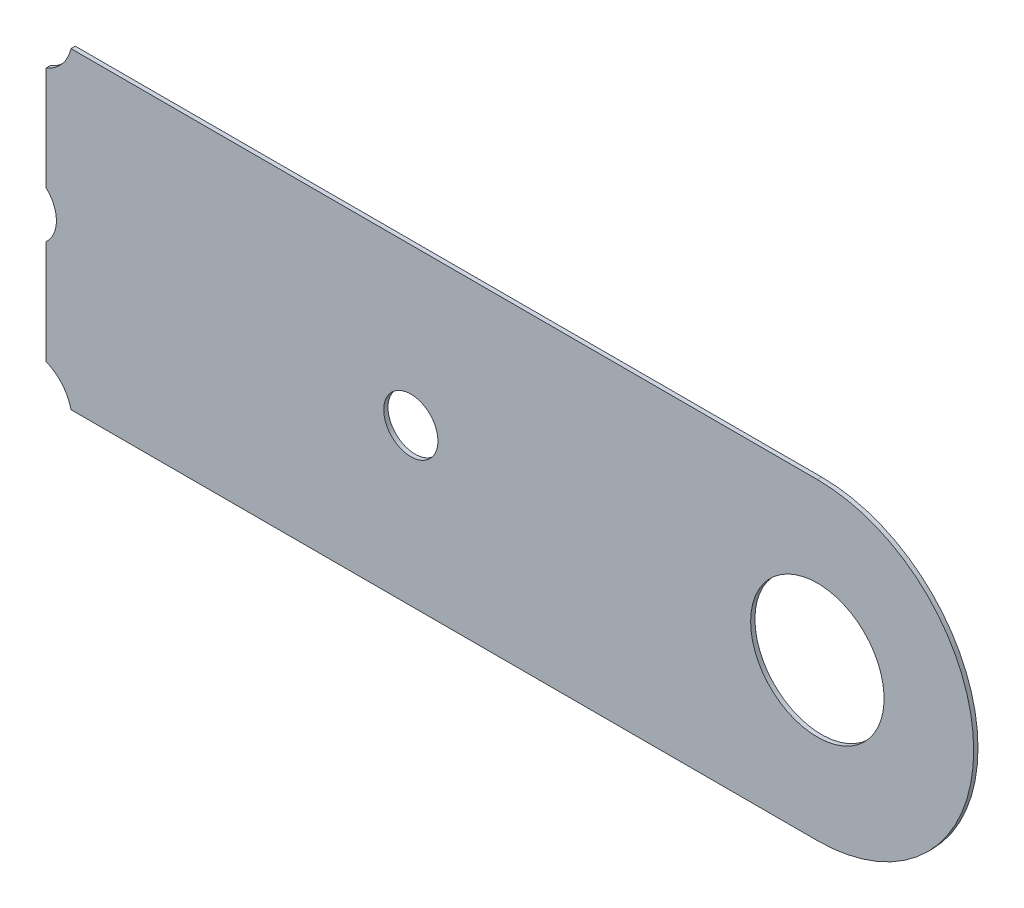
ISO-10303-21;
HEADER;
FILE_DESCRIPTION(('STEP AP214'),'2;1');
FILE_NAME('part.step','',(''),(''),'','','');
FILE_SCHEMA(('AUTOMOTIVE_DESIGN { 1 0 10303 214 1 1 1 1 }'));
ENDSEC;
DATA;
#1=APPLICATION_CONTEXT('core data for automotive mechanical design processes');
#2=APPLICATION_PROTOCOL_DEFINITION('international standard','automotive_design',2000,#1);
#3=PRODUCT_CONTEXT('',#1,'mechanical');
#4=PRODUCT('Part','Part','',(#3));
#5=PRODUCT_RELATED_PRODUCT_CATEGORY('part','',(#4));
#6=PRODUCT_DEFINITION_FORMATION('','',#4);
#7=PRODUCT_DEFINITION_CONTEXT('part definition',#1,'design');
#8=PRODUCT_DEFINITION('design','',#6,#7);
#9=PRODUCT_DEFINITION_SHAPE('','',#8);
#10=(LENGTH_UNIT() NAMED_UNIT(*) SI_UNIT(.MILLI.,.METRE.));
#11=(NAMED_UNIT(*) PLANE_ANGLE_UNIT() SI_UNIT($,.RADIAN.));
#12=(NAMED_UNIT(*) SI_UNIT($,.STERADIAN.) SOLID_ANGLE_UNIT());
#13=UNCERTAINTY_MEASURE_WITH_UNIT(LENGTH_MEASURE(1.E-05),#10,'distance_accuracy_value','');
#14=(GEOMETRIC_REPRESENTATION_CONTEXT(3) GLOBAL_UNCERTAINTY_ASSIGNED_CONTEXT((#13)) GLOBAL_UNIT_ASSIGNED_CONTEXT((#10,
#11,#12)) REPRESENTATION_CONTEXT('',''));
#15=CARTESIAN_POINT('',(0.,0.,0.));
#16=DIRECTION('',(0.,0.,1.));
#17=DIRECTION('',(1.,0.,0.));
#18=AXIS2_PLACEMENT_3D('',#15,#16,#17);
#19=CARTESIAN_POINT('',(0.,12.7639318,0.41148));
#20=DIRECTION('',(0.,0.,-1.));
#21=DIRECTION('',(-1.,0.,0.));
#22=AXIS2_PLACEMENT_3D('',#19,#20,#21);
#23=PLANE('',#22);
#24=CARTESIAN_POINT('',(73.99999932,15.00000048,0.41148));
#25=DIRECTION('',(0.,0.,-1.));
#26=DIRECTION('',(-1.,0.,0.));
#27=AXIS2_PLACEMENT_3D('',#24,#25,#26);
#28=CIRCLE('',#27,6.3999999);
#29=CARTESIAN_POINT('',(67.59999942,15.00000048,0.41148));
#30=VERTEX_POINT('',#29);
#31=EDGE_CURVE('E132',#30,#30,#28,.T.);
#32=ORIENTED_EDGE('',*,*,#31,.T.);
#33=EDGE_LOOP('',(#32));
#34=FACE_BOUND('',#33,.T.);
#35=CARTESIAN_POINT('',(35.00000112,15.00000048,0.41148));
#36=DIRECTION('',(0.,0.,-1.));
#37=DIRECTION('',(-1.,0.,0.));
#38=AXIS2_PLACEMENT_3D('',#35,#36,#37);
#39=CIRCLE('',#38,2.59999988);
#40=CARTESIAN_POINT('',(32.40000124,15.00000048,0.41148));
#41=VERTEX_POINT('',#40);
#42=EDGE_CURVE('E135',#41,#41,#39,.T.);
#43=ORIENTED_EDGE('',*,*,#42,.T.);
#44=EDGE_LOOP('',(#43));
#45=FACE_BOUND('',#44,.T.);
#46=CARTESIAN_POINT('',(-1.500005936344,-0.900000909921,0.41148));
#47=DIRECTION('',(0.,0.,-1.));
#48=DIRECTION('',(-1.,0.,0.));
#49=AXIS2_PLACEMENT_3D('',#46,#47,#48);
#50=CIRCLE('',#49,4.00000334447);
#51=CARTESIAN_POINT('',(0.,2.80809953999997,0.41148));
#52=VERTEX_POINT('',#51);
#53=CARTESIAN_POINT('',(2.39743234000016,0.,0.41148));
#54=VERTEX_POINT('',#53);
#55=EDGE_CURVE('E110',#52,#54,#50,.T.);
#56=ORIENTED_EDGE('',*,*,#55,.T.);
#57=DIRECTION('',(1.,0.,0.));
#58=VECTOR('',#57,1.);
#59=CARTESIAN_POINT('',(73.99999932,0.,0.41148));
#60=LINE('',#59,#58);
#61=CARTESIAN_POINT('',(73.99999932,0.,0.41148));
#62=VERTEX_POINT('',#61);
#63=EDGE_CURVE('E107',#62,#54,#60,.F.);
#64=ORIENTED_EDGE('',*,*,#63,.F.);
#65=CARTESIAN_POINT('',(73.99999932,15.00000048,0.41148));
#66=DIRECTION('',(0.,0.,-1.));
#67=DIRECTION('',(-1.,0.,0.));
#68=AXIS2_PLACEMENT_3D('',#65,#66,#67);
#69=CIRCLE('',#68,15.00000048);
#70=CARTESIAN_POINT('',(73.99999932,30.00000096,0.41148));
#71=VERTEX_POINT('',#70);
#72=EDGE_CURVE('E140',#71,#62,#69,.T.);
#73=ORIENTED_EDGE('',*,*,#72,.F.);
#74=DIRECTION('',(1.,0.,0.));
#75=VECTOR('',#74,1.);
#76=CARTESIAN_POINT('',(2.39743488,30.00000096,0.41148));
#77=LINE('',#76,#75);
#78=CARTESIAN_POINT('',(2.3974348800001,30.00000096,0.41148));
#79=VERTEX_POINT('',#78);
#80=EDGE_CURVE('E112',#79,#71,#77,.T.);
#81=ORIENTED_EDGE('',*,*,#80,.F.);
#82=CARTESIAN_POINT('',(-1.499997542216,30.899999585498,0.41148));
#83=DIRECTION('',(0.,0.,-1.));
#84=DIRECTION('',(-1.,0.,0.));
#85=AXIS2_PLACEMENT_3D('',#82,#83,#84);
#86=CIRCLE('',#85,3.999997126454);
#87=CARTESIAN_POINT('',(-2.54000005528171E-06,27.1919014200003,0.41148));
#88=VERTEX_POINT('',#87);
#89=EDGE_CURVE('E92',#79,#88,#86,.T.);
#90=ORIENTED_EDGE('',*,*,#89,.T.);
#91=DIRECTION('',(2.55126772493192E-07,-0.999999999999967,0.));
#92=VECTOR('',#91,1.);
#93=CARTESIAN_POINT('',(0.,17.23606662,0.41148));
#94=LINE('',#93,#92);
#95=CARTESIAN_POINT('',(0.,17.2360666199999,0.41148));
#96=VERTEX_POINT('',#95);
#97=EDGE_CURVE('E90',#96,#88,#94,.F.);
#98=ORIENTED_EDGE('',*,*,#97,.F.);
#99=CARTESIAN_POINT('',(-2.000004731039,14.99999921,0.41148));
#100=DIRECTION('',(0.,0.,-1.));
#101=DIRECTION('',(-1.,0.,0.));
#102=AXIS2_PLACEMENT_3D('',#99,#100,#101);
#103=CIRCLE('',#102,3.000002731039);
#104=CARTESIAN_POINT('',(0.,12.7639318000001,0.41148));
#105=VERTEX_POINT('',#104);
#106=EDGE_CURVE('E20',#96,#105,#103,.T.);
#107=ORIENTED_EDGE('',*,*,#106,.T.);
#108=DIRECTION('',(0.,1.,0.));
#109=VECTOR('',#108,1.);
#110=CARTESIAN_POINT('',(0.,2.80809954,0.41148));
#111=LINE('',#110,#109);
#112=EDGE_CURVE('E105',#52,#105,#111,.T.);
#113=ORIENTED_EDGE('',*,*,#112,.F.);
#114=EDGE_LOOP('',(#56,#64,#73,#81,#90,#98,#107,#113));
#115=FACE_BOUND('',#114,.T.);
#116=ADVANCED_FACE('F17',(#34,#45,#115),#23,.F.);
#117=CARTESIAN_POINT('',(-2.000004731039,14.99999921,0.));
#118=DIRECTION('',(0.,0.,-1.));
#119=DIRECTION('',(-1.,0.,0.));
#120=AXIS2_PLACEMENT_3D('',#117,#118,#119);
#121=CYLINDRICAL_SURFACE('',#120,3.000002731039);
#122=ORIENTED_EDGE('',*,*,#106,.F.);
#123=DIRECTION('',(0.,0.,1.));
#124=VECTOR('',#123,1.);
#125=CARTESIAN_POINT('',(0.,17.23606662,0.));
#126=LINE('',#125,#124);
#127=CARTESIAN_POINT('',(0.,17.2360666199999,0.));
#128=VERTEX_POINT('',#127);
#129=EDGE_CURVE('E82',#128,#96,#126,.T.);
#130=ORIENTED_EDGE('',*,*,#129,.F.);
#131=CARTESIAN_POINT('',(-2.000004731039,14.99999921,0.));
#132=DIRECTION('',(0.,0.,-1.));
#133=DIRECTION('',(-1.,0.,0.));
#134=AXIS2_PLACEMENT_3D('',#131,#132,#133);
#135=CIRCLE('',#134,3.000002731039);
#136=CARTESIAN_POINT('',(0.,12.7639318000001,0.));
#137=VERTEX_POINT('',#136);
#138=EDGE_CURVE('E130',#137,#128,#135,.F.);
#139=ORIENTED_EDGE('',*,*,#138,.F.);
#140=DIRECTION('',(0.,0.,1.));
#141=VECTOR('',#140,1.);
#142=CARTESIAN_POINT('',(0.,12.7639318,0.));
#143=LINE('',#142,#141);
#144=EDGE_CURVE('E85',#105,#137,#143,.F.);
#145=ORIENTED_EDGE('',*,*,#144,.F.);
#146=EDGE_LOOP('',(#122,#130,#139,#145));
#147=FACE_BOUND('',#146,.T.);
#148=ADVANCED_FACE('F80',(#147),#121,.F.);
#149=CARTESIAN_POINT('',(0.,17.23606662,0.));
#150=DIRECTION('',(-0.999999999999967,-2.55126772493192E-07,0.));
#151=DIRECTION('',(2.55126772493192E-07,-0.999999999999967,0.));
#152=AXIS2_PLACEMENT_3D('',#149,#150,#151);
#153=PLANE('',#152);
#154=DIRECTION('',(0.,0.,-1.));
#155=VECTOR('',#154,1.);
#156=CARTESIAN_POINT('',(-2.54000011063078E-06,27.1919014200003,0.));
#157=LINE('',#156,#155);
#158=CARTESIAN_POINT('',(-1.27000005542381E-06,27.1919019337395,0.));
#159=VERTEX_POINT('',#158);
#160=EDGE_CURVE('E103',#88,#159,#157,.T.);
#161=ORIENTED_EDGE('',*,*,#160,.T.);
#162=DIRECTION('',(0.,1.,0.));
#163=VECTOR('',#162,1.);
#164=CARTESIAN_POINT('',(0.,12.7639318,0.));
#165=LINE('',#164,#163);
#166=EDGE_CURVE('E98',#128,#159,#165,.T.);
#167=ORIENTED_EDGE('',*,*,#166,.F.);
#168=ORIENTED_EDGE('',*,*,#129,.T.);
#169=ORIENTED_EDGE('',*,*,#97,.T.);
#170=EDGE_LOOP('',(#161,#167,#168,#169));
#171=FACE_BOUND('',#170,.T.);
#172=ADVANCED_FACE('F96',(#171),#153,.T.);
#173=CARTESIAN_POINT('',(-1.499997542216,30.899999585498,0.));
#174=DIRECTION('',(0.,0.,-1.));
#175=DIRECTION('',(-1.,0.,0.));
#176=AXIS2_PLACEMENT_3D('',#173,#174,#175);
#177=CYLINDRICAL_SURFACE('',#176,3.999997126454);
#178=ORIENTED_EDGE('',*,*,#89,.F.);
#179=DIRECTION('',(0.,0.,1.));
#180=VECTOR('',#179,1.);
#181=CARTESIAN_POINT('',(2.39743488,30.00000096,0.));
#182=LINE('',#181,#180);
#183=CARTESIAN_POINT('',(2.3974348800001,30.00000096,0.));
#184=VERTEX_POINT('',#183);
#185=EDGE_CURVE('E114',#184,#79,#182,.T.);
#186=ORIENTED_EDGE('',*,*,#185,.F.);
#187=CARTESIAN_POINT('',(-1.499997542216,30.899999585498,0.));
#188=DIRECTION('',(0.,0.,-1.));
#189=DIRECTION('',(-1.,0.,0.));
#190=AXIS2_PLACEMENT_3D('',#187,#188,#189);
#191=CIRCLE('',#190,3.999997126454);
#192=EDGE_CURVE('E127',#159,#184,#191,.F.);
#193=ORIENTED_EDGE('',*,*,#192,.F.);
#194=ORIENTED_EDGE('',*,*,#160,.F.);
#195=EDGE_LOOP('',(#178,#186,#193,#194));
#196=FACE_BOUND('',#195,.T.);
#197=ADVANCED_FACE('F175',(#196),#177,.F.);
#198=CARTESIAN_POINT('',(2.39743488,30.00000096,0.));
#199=DIRECTION('',(0.,1.,0.));
#200=DIRECTION('',(0.,0.,1.));
#201=AXIS2_PLACEMENT_3D('',#198,#199,#200);
#202=PLANE('',#201);
#203=DIRECTION('',(0.,0.,-1.));
#204=VECTOR('',#203,1.);
#205=CARTESIAN_POINT('',(73.99999932,30.00000096,0.));
#206=LINE('',#205,#204);
#207=CARTESIAN_POINT('',(73.99999932,30.00000096,0.));
#208=VERTEX_POINT('',#207);
#209=EDGE_CURVE('E113',#208,#71,#206,.F.);
#210=ORIENTED_EDGE('',*,*,#209,.F.);
#211=DIRECTION('',(-1.,0.,0.));
#212=VECTOR('',#211,1.);
#213=CARTESIAN_POINT('',(0.,30.00000096,0.));
#214=LINE('',#213,#212);
#215=EDGE_CURVE('E126',#184,#208,#214,.F.);
#216=ORIENTED_EDGE('',*,*,#215,.F.);
#217=ORIENTED_EDGE('',*,*,#185,.T.);
#218=ORIENTED_EDGE('',*,*,#80,.T.);
#219=EDGE_LOOP('',(#210,#216,#217,#218));
#220=FACE_BOUND('',#219,.T.);
#221=ADVANCED_FACE('F173',(#220),#202,.T.);
#222=CARTESIAN_POINT('',(73.99999932,15.00000048,0.));
#223=DIRECTION('',(0.,0.,-1.));
#224=DIRECTION('',(-1.,0.,0.));
#225=AXIS2_PLACEMENT_3D('',#222,#223,#224);
#226=CYLINDRICAL_SURFACE('',#225,15.00000048);
#227=DIRECTION('',(0.,0.,-1.));
#228=VECTOR('',#227,1.);
#229=CARTESIAN_POINT('',(73.99999932,0.,0.));
#230=LINE('',#229,#228);
#231=CARTESIAN_POINT('',(73.99999932,0.,0.));
#232=VERTEX_POINT('',#231);
#233=EDGE_CURVE('E111',#232,#62,#230,.F.);
#234=ORIENTED_EDGE('',*,*,#233,.F.);
#235=CARTESIAN_POINT('',(73.99999932,15.00000048,0.));
#236=DIRECTION('',(0.,0.,-1.));
#237=DIRECTION('',(-1.,0.,0.));
#238=AXIS2_PLACEMENT_3D('',#235,#236,#237);
#239=CIRCLE('',#238,15.00000048);
#240=EDGE_CURVE('E123',#208,#232,#239,.T.);
#241=ORIENTED_EDGE('',*,*,#240,.F.);
#242=ORIENTED_EDGE('',*,*,#209,.T.);
#243=ORIENTED_EDGE('',*,*,#72,.T.);
#244=EDGE_LOOP('',(#234,#241,#242,#243));
#245=FACE_BOUND('',#244,.T.);
#246=ADVANCED_FACE('F172',(#245),#226,.T.);
#247=CARTESIAN_POINT('',(73.99999932,0.,0.));
#248=DIRECTION('',(0.,-1.,0.));
#249=DIRECTION('',(0.,0.,-1.));
#250=AXIS2_PLACEMENT_3D('',#247,#248,#249);
#251=PLANE('',#250);
#252=DIRECTION('',(0.,0.,-1.));
#253=VECTOR('',#252,1.);
#254=CARTESIAN_POINT('',(2.39743234000015,0.,0.));
#255=LINE('',#254,#253);
#256=CARTESIAN_POINT('',(2.39743234000016,0.,0.));
#257=VERTEX_POINT('',#256);
#258=EDGE_CURVE('E139',#54,#257,#255,.T.);
#259=ORIENTED_EDGE('',*,*,#258,.T.);
#260=DIRECTION('',(-1.,0.,0.));
#261=VECTOR('',#260,1.);
#262=CARTESIAN_POINT('',(0.,0.,0.));
#263=LINE('',#262,#261);
#264=EDGE_CURVE('E122',#232,#257,#263,.T.);
#265=ORIENTED_EDGE('',*,*,#264,.F.);
#266=ORIENTED_EDGE('',*,*,#233,.T.);
#267=ORIENTED_EDGE('',*,*,#63,.T.);
#268=EDGE_LOOP('',(#259,#265,#266,#267));
#269=FACE_BOUND('',#268,.T.);
#270=ADVANCED_FACE('F167',(#269),#251,.T.);
#271=CARTESIAN_POINT('',(-1.500005936344,-0.900000909921,0.));
#272=DIRECTION('',(0.,0.,-1.));
#273=DIRECTION('',(-1.,0.,0.));
#274=AXIS2_PLACEMENT_3D('',#271,#272,#273);
#275=CYLINDRICAL_SURFACE('',#274,4.00000334447);
#276=ORIENTED_EDGE('',*,*,#55,.F.);
#277=DIRECTION('',(0.,0.,1.));
#278=VECTOR('',#277,1.);
#279=CARTESIAN_POINT('',(0.,2.80809954,0.));
#280=LINE('',#279,#278);
#281=CARTESIAN_POINT('',(0.,2.80809953999997,0.));
#282=VERTEX_POINT('',#281);
#283=EDGE_CURVE('E35',#282,#52,#280,.T.);
#284=ORIENTED_EDGE('',*,*,#283,.F.);
#285=CARTESIAN_POINT('',(-1.500005936344,-0.900000909921,0.));
#286=DIRECTION('',(0.,0.,-1.));
#287=DIRECTION('',(-1.,0.,0.));
#288=AXIS2_PLACEMENT_3D('',#285,#286,#287);
#289=CIRCLE('',#288,4.00000334447);
#290=EDGE_CURVE('E119',#257,#282,#289,.F.);
#291=ORIENTED_EDGE('',*,*,#290,.F.);
#292=ORIENTED_EDGE('',*,*,#258,.F.);
#293=EDGE_LOOP('',(#276,#284,#291,#292));
#294=FACE_BOUND('',#293,.T.);
#295=ADVANCED_FACE('F169',(#294),#275,.F.);
#296=CARTESIAN_POINT('',(0.,2.80809954,0.));
#297=DIRECTION('',(-1.,0.,0.));
#298=DIRECTION('',(0.,0.,1.));
#299=AXIS2_PLACEMENT_3D('',#296,#297,#298);
#300=PLANE('',#299);
#301=ORIENTED_EDGE('',*,*,#144,.T.);
#302=DIRECTION('',(0.,1.,0.));
#303=VECTOR('',#302,1.);
#304=CARTESIAN_POINT('',(0.,12.7639318,0.));
#305=LINE('',#304,#303);
#306=EDGE_CURVE('E118',#282,#137,#305,.T.);
#307=ORIENTED_EDGE('',*,*,#306,.F.);
#308=ORIENTED_EDGE('',*,*,#283,.T.);
#309=ORIENTED_EDGE('',*,*,#112,.T.);
#310=EDGE_LOOP('',(#301,#307,#308,#309));
#311=FACE_BOUND('',#310,.T.);
#312=ADVANCED_FACE('F162',(#311),#300,.T.);
#313=CARTESIAN_POINT('',(35.00000112,15.00000048,0.));
#314=DIRECTION('',(0.,0.,-1.));
#315=DIRECTION('',(-1.,0.,0.));
#316=AXIS2_PLACEMENT_3D('',#313,#314,#315);
#317=CYLINDRICAL_SURFACE('',#316,2.59999988);
#318=ORIENTED_EDGE('',*,*,#42,.F.);
#319=EDGE_LOOP('',(#318));
#320=FACE_BOUND('',#319,.T.);
#321=CARTESIAN_POINT('',(35.00000112,15.00000048,0.));
#322=DIRECTION('',(0.,0.,-1.));
#323=DIRECTION('',(-1.,0.,0.));
#324=AXIS2_PLACEMENT_3D('',#321,#322,#323);
#325=CIRCLE('',#324,2.59999988);
#326=CARTESIAN_POINT('',(32.40000124,15.00000048,0.));
#327=VERTEX_POINT('',#326);
#328=EDGE_CURVE('E26',#327,#327,#325,.F.);
#329=ORIENTED_EDGE('',*,*,#328,.F.);
#330=EDGE_LOOP('',(#329));
#331=FACE_BOUND('',#330,.T.);
#332=ADVANCED_FACE('F192',(#320,#331),#317,.F.);
#333=CARTESIAN_POINT('',(73.99999932,15.00000048,0.));
#334=DIRECTION('',(0.,0.,-1.));
#335=DIRECTION('',(-1.,0.,0.));
#336=AXIS2_PLACEMENT_3D('',#333,#334,#335);
#337=CYLINDRICAL_SURFACE('',#336,6.3999999);
#338=ORIENTED_EDGE('',*,*,#31,.F.);
#339=EDGE_LOOP('',(#338));
#340=FACE_BOUND('',#339,.T.);
#341=CARTESIAN_POINT('',(73.99999932,15.00000048,0.));
#342=DIRECTION('',(0.,0.,-1.));
#343=DIRECTION('',(-1.,0.,0.));
#344=AXIS2_PLACEMENT_3D('',#341,#342,#343);
#345=CIRCLE('',#344,6.3999999);
#346=CARTESIAN_POINT('',(67.59999942,15.00000048,0.));
#347=VERTEX_POINT('',#346);
#348=EDGE_CURVE('E11',#347,#347,#345,.F.);
#349=ORIENTED_EDGE('',*,*,#348,.F.);
#350=EDGE_LOOP('',(#349));
#351=FACE_BOUND('',#350,.T.);
#352=ADVANCED_FACE('F186',(#340,#351),#337,.F.);
#353=CARTESIAN_POINT('',(0.,12.7639318,0.));
#354=DIRECTION('',(0.,0.,-1.));
#355=DIRECTION('',(-1.,0.,0.));
#356=AXIS2_PLACEMENT_3D('',#353,#354,#355);
#357=PLANE('',#356);
#358=ORIENTED_EDGE('',*,*,#348,.T.);
#359=EDGE_LOOP('',(#358));
#360=FACE_BOUND('',#359,.T.);
#361=ORIENTED_EDGE('',*,*,#328,.T.);
#362=EDGE_LOOP('',(#361));
#363=FACE_BOUND('',#362,.T.);
#364=ORIENTED_EDGE('',*,*,#290,.T.);
#365=ORIENTED_EDGE('',*,*,#306,.T.);
#366=ORIENTED_EDGE('',*,*,#138,.T.);
#367=ORIENTED_EDGE('',*,*,#166,.T.);
#368=ORIENTED_EDGE('',*,*,#192,.T.);
#369=ORIENTED_EDGE('',*,*,#215,.T.);
#370=ORIENTED_EDGE('',*,*,#240,.T.);
#371=ORIENTED_EDGE('',*,*,#264,.T.);
#372=EDGE_LOOP('',(#364,#365,#366,#367,#368,#369,#370,#371));
#373=FACE_BOUND('',#372,.T.);
#374=ADVANCED_FACE('F160',(#360,#363,#373),#357,.T.);
#375=CLOSED_SHELL('',(#116,#148,#172,#197,#221,#246,#270,#295,#312,#332,#352,#374));
#376=MANIFOLD_SOLID_BREP('B1',#375);
#377=ADVANCED_BREP_SHAPE_REPRESENTATION('',(#18,#376),#14);
#378=SHAPE_DEFINITION_REPRESENTATION(#9,#377);
ENDSEC;
END-ISO-10303-21;
